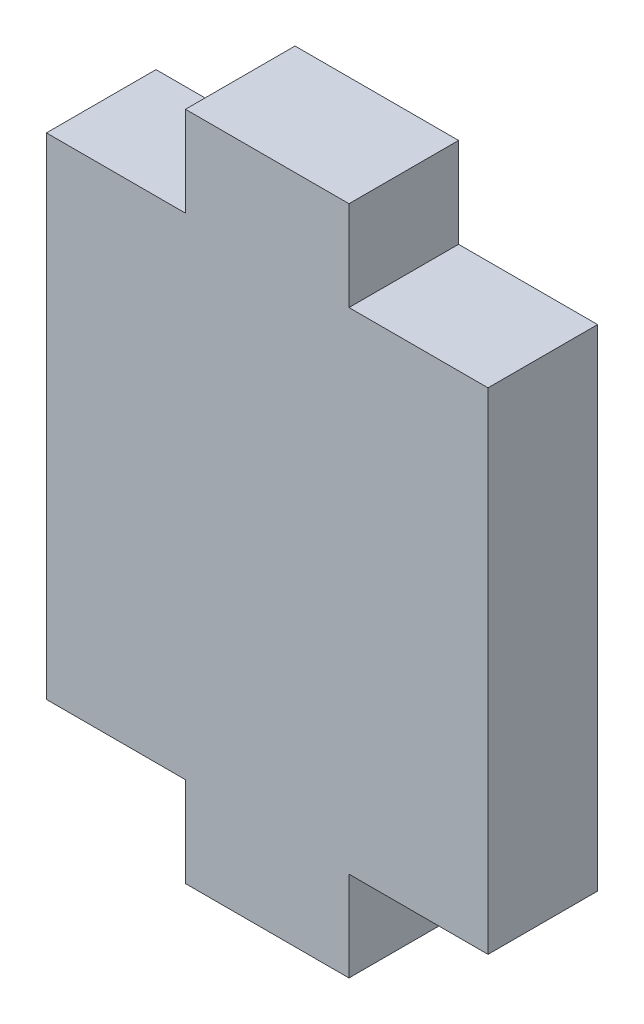
ISO-10303-21;
HEADER;
FILE_DESCRIPTION(('STEP AP214'),'2;1');
FILE_NAME('part.step','',(''),(''),'','','');
FILE_SCHEMA(('AUTOMOTIVE_DESIGN { 1 0 10303 214 1 1 1 1 }'));
ENDSEC;
DATA;
#1=APPLICATION_CONTEXT('core data for automotive mechanical design processes');
#2=APPLICATION_PROTOCOL_DEFINITION('international standard','automotive_design',2000,#1);
#3=PRODUCT_CONTEXT('',#1,'mechanical');
#4=PRODUCT('Part','Part','',(#3));
#5=PRODUCT_RELATED_PRODUCT_CATEGORY('part','',(#4));
#6=PRODUCT_DEFINITION_FORMATION('','',#4);
#7=PRODUCT_DEFINITION_CONTEXT('part definition',#1,'design');
#8=PRODUCT_DEFINITION('design','',#6,#7);
#9=PRODUCT_DEFINITION_SHAPE('','',#8);
#10=(LENGTH_UNIT() NAMED_UNIT(*) SI_UNIT(.MILLI.,.METRE.));
#11=(NAMED_UNIT(*) PLANE_ANGLE_UNIT() SI_UNIT($,.RADIAN.));
#12=(NAMED_UNIT(*) SI_UNIT($,.STERADIAN.) SOLID_ANGLE_UNIT());
#13=UNCERTAINTY_MEASURE_WITH_UNIT(LENGTH_MEASURE(1.E-05),#10,'distance_accuracy_value','');
#14=(GEOMETRIC_REPRESENTATION_CONTEXT(3) GLOBAL_UNCERTAINTY_ASSIGNED_CONTEXT((#13)) GLOBAL_UNIT_ASSIGNED_CONTEXT((#10,
#11,#12)) REPRESENTATION_CONTEXT('',''));
#15=CARTESIAN_POINT('',(0.,0.,0.));
#16=DIRECTION('',(0.,0.,1.));
#17=DIRECTION('',(1.,0.,0.));
#18=AXIS2_PLACEMENT_3D('',#15,#16,#17);
#19=CARTESIAN_POINT('',(5.,15.,-6.7));
#20=DIRECTION('',(0.,-1.,0.));
#21=DIRECTION('',(1.,0.,0.));
#22=AXIS2_PLACEMENT_3D('',#19,#20,#21);
#23=PLANE('',#22);
#24=DIRECTION('',(-1.,0.,0.));
#25=VECTOR('',#24,1.);
#26=CARTESIAN_POINT('',(5.,15.,0.));
#27=LINE('',#26,#25);
#28=CARTESIAN_POINT('',(13.5,15.,0.));
#29=VERTEX_POINT('',#28);
#30=CARTESIAN_POINT('',(5.,15.,0.));
#31=VERTEX_POINT('',#30);
#32=EDGE_CURVE('E155',#29,#31,#27,.T.);
#33=ORIENTED_EDGE('',*,*,#32,.F.);
#34=DIRECTION('',(0.,0.,1.));
#35=VECTOR('',#34,1.);
#36=CARTESIAN_POINT('',(13.5,15.,-6.7));
#37=LINE('',#36,#35);
#38=CARTESIAN_POINT('',(13.5,15.,-6.7));
#39=VERTEX_POINT('',#38);
#40=EDGE_CURVE('E154',#39,#29,#37,.T.);
#41=ORIENTED_EDGE('',*,*,#40,.F.);
#42=DIRECTION('',(-1.,0.,0.));
#43=VECTOR('',#42,1.);
#44=CARTESIAN_POINT('',(5.,15.,-6.7));
#45=LINE('',#44,#43);
#46=CARTESIAN_POINT('',(5.,15.,-6.7));
#47=VERTEX_POINT('',#46);
#48=EDGE_CURVE('E185',#39,#47,#45,.T.);
#49=ORIENTED_EDGE('',*,*,#48,.T.);
#50=DIRECTION('',(0.,0.,1.));
#51=VECTOR('',#50,1.);
#52=CARTESIAN_POINT('',(5.,15.,-6.7));
#53=LINE('',#52,#51);
#54=EDGE_CURVE('E11',#47,#31,#53,.T.);
#55=ORIENTED_EDGE('',*,*,#54,.T.);
#56=EDGE_LOOP('',(#33,#41,#49,#55));
#57=FACE_BOUND('',#56,.T.);
#58=ADVANCED_FACE('F35',(#57),#23,.F.);
#59=CARTESIAN_POINT('',(5.,15.,-6.7));
#60=DIRECTION('',(-1.,0.,0.));
#61=DIRECTION('',(0.,0.,-1.));
#62=AXIS2_PLACEMENT_3D('',#59,#60,#61);
#63=PLANE('',#62);
#64=DIRECTION('',(0.,1.,0.));
#65=VECTOR('',#64,1.);
#66=CARTESIAN_POINT('',(5.,15.,0.));
#67=LINE('',#66,#65);
#68=CARTESIAN_POINT('',(5.,20.5,0.));
#69=VERTEX_POINT('',#68);
#70=EDGE_CURVE('E157',#31,#69,#67,.T.);
#71=ORIENTED_EDGE('',*,*,#70,.F.);
#72=ORIENTED_EDGE('',*,*,#54,.F.);
#73=DIRECTION('',(0.,1.,0.));
#74=VECTOR('',#73,1.);
#75=CARTESIAN_POINT('',(5.,15.,-6.7));
#76=LINE('',#75,#74);
#77=CARTESIAN_POINT('',(5.,20.5,-6.7));
#78=VERTEX_POINT('',#77);
#79=EDGE_CURVE('E101',#47,#78,#76,.T.);
#80=ORIENTED_EDGE('',*,*,#79,.T.);
#81=DIRECTION('',(0.,0.,1.));
#82=VECTOR('',#81,1.);
#83=CARTESIAN_POINT('',(5.,20.5,-6.7));
#84=LINE('',#83,#82);
#85=EDGE_CURVE('E43',#78,#69,#84,.T.);
#86=ORIENTED_EDGE('',*,*,#85,.T.);
#87=EDGE_LOOP('',(#71,#72,#80,#86));
#88=FACE_BOUND('',#87,.T.);
#89=ADVANCED_FACE('F209',(#88),#63,.F.);
#90=CARTESIAN_POINT('',(5.,20.5,-6.7));
#91=DIRECTION('',(0.,-1.,0.));
#92=DIRECTION('',(0.,0.,1.));
#93=AXIS2_PLACEMENT_3D('',#90,#91,#92);
#94=PLANE('',#93);
#95=DIRECTION('',(-1.,0.,0.));
#96=VECTOR('',#95,1.);
#97=CARTESIAN_POINT('',(5.,20.5,0.));
#98=LINE('',#97,#96);
#99=CARTESIAN_POINT('',(-5.,20.5,0.));
#100=VERTEX_POINT('',#99);
#101=EDGE_CURVE('E160',#69,#100,#98,.T.);
#102=ORIENTED_EDGE('',*,*,#101,.F.);
#103=ORIENTED_EDGE('',*,*,#85,.F.);
#104=DIRECTION('',(-1.,0.,0.));
#105=VECTOR('',#104,1.);
#106=CARTESIAN_POINT('',(5.,20.5,-6.7));
#107=LINE('',#106,#105);
#108=CARTESIAN_POINT('',(-5.,20.5,-6.7));
#109=VERTEX_POINT('',#108);
#110=EDGE_CURVE('E218',#78,#109,#107,.T.);
#111=ORIENTED_EDGE('',*,*,#110,.T.);
#112=DIRECTION('',(0.,0.,1.));
#113=VECTOR('',#112,1.);
#114=CARTESIAN_POINT('',(-5.,20.5,-6.7));
#115=LINE('',#114,#113);
#116=EDGE_CURVE('E204',#109,#100,#115,.T.);
#117=ORIENTED_EDGE('',*,*,#116,.T.);
#118=EDGE_LOOP('',(#102,#103,#111,#117));
#119=FACE_BOUND('',#118,.T.);
#120=ADVANCED_FACE('F252',(#119),#94,.F.);
#121=CARTESIAN_POINT('',(-5.,15.,-6.7));
#122=DIRECTION('',(1.,0.,0.));
#123=DIRECTION('',(0.,0.,1.));
#124=AXIS2_PLACEMENT_3D('',#121,#122,#123);
#125=PLANE('',#124);
#126=DIRECTION('',(0.,-1.,0.));
#127=VECTOR('',#126,1.);
#128=CARTESIAN_POINT('',(-5.,15.,0.));
#129=LINE('',#128,#127);
#130=CARTESIAN_POINT('',(-5.,15.,0.));
#131=VERTEX_POINT('',#130);
#132=EDGE_CURVE('E163',#100,#131,#129,.T.);
#133=ORIENTED_EDGE('',*,*,#132,.F.);
#134=ORIENTED_EDGE('',*,*,#116,.F.);
#135=DIRECTION('',(0.,-1.,0.));
#136=VECTOR('',#135,1.);
#137=CARTESIAN_POINT('',(-5.,15.,-6.7));
#138=LINE('',#137,#136);
#139=CARTESIAN_POINT('',(-5.,15.,-6.7));
#140=VERTEX_POINT('',#139);
#141=EDGE_CURVE('E222',#109,#140,#138,.T.);
#142=ORIENTED_EDGE('',*,*,#141,.T.);
#143=DIRECTION('',(0.,0.,1.));
#144=VECTOR('',#143,1.);
#145=CARTESIAN_POINT('',(-5.,15.,-6.7));
#146=LINE('',#145,#144);
#147=EDGE_CURVE('E201',#140,#131,#146,.T.);
#148=ORIENTED_EDGE('',*,*,#147,.T.);
#149=EDGE_LOOP('',(#133,#134,#142,#148));
#150=FACE_BOUND('',#149,.T.);
#151=ADVANCED_FACE('F251',(#150),#125,.F.);
#152=CARTESIAN_POINT('',(-13.5,15.,-6.7));
#153=DIRECTION('',(0.,-1.,0.));
#154=DIRECTION('',(0.,0.,1.));
#155=AXIS2_PLACEMENT_3D('',#152,#153,#154);
#156=PLANE('',#155);
#157=DIRECTION('',(-1.,0.,0.));
#158=VECTOR('',#157,1.);
#159=CARTESIAN_POINT('',(-13.5,15.,0.));
#160=LINE('',#159,#158);
#161=CARTESIAN_POINT('',(-13.5,15.,0.));
#162=VERTEX_POINT('',#161);
#163=EDGE_CURVE('E166',#131,#162,#160,.T.);
#164=ORIENTED_EDGE('',*,*,#163,.F.);
#165=ORIENTED_EDGE('',*,*,#147,.F.);
#166=DIRECTION('',(-1.,0.,0.));
#167=VECTOR('',#166,1.);
#168=CARTESIAN_POINT('',(-13.5,15.,-6.7));
#169=LINE('',#168,#167);
#170=CARTESIAN_POINT('',(-13.5,15.,-6.7));
#171=VERTEX_POINT('',#170);
#172=EDGE_CURVE('E225',#140,#171,#169,.T.);
#173=ORIENTED_EDGE('',*,*,#172,.T.);
#174=DIRECTION('',(0.,0.,1.));
#175=VECTOR('',#174,1.);
#176=CARTESIAN_POINT('',(-13.5,15.,-6.7));
#177=LINE('',#176,#175);
#178=EDGE_CURVE('E198',#171,#162,#177,.T.);
#179=ORIENTED_EDGE('',*,*,#178,.T.);
#180=EDGE_LOOP('',(#164,#165,#173,#179));
#181=FACE_BOUND('',#180,.T.);
#182=ADVANCED_FACE('F249',(#181),#156,.F.);
#183=CARTESIAN_POINT('',(-13.5,-15.,-6.7));
#184=DIRECTION('',(1.,0.,0.));
#185=DIRECTION('',(0.,0.,1.));
#186=AXIS2_PLACEMENT_3D('',#183,#184,#185);
#187=PLANE('',#186);
#188=DIRECTION('',(0.,-1.,0.));
#189=VECTOR('',#188,1.);
#190=CARTESIAN_POINT('',(-13.5,-15.,0.));
#191=LINE('',#190,#189);
#192=CARTESIAN_POINT('',(-13.5,-15.,0.));
#193=VERTEX_POINT('',#192);
#194=EDGE_CURVE('E169',#162,#193,#191,.T.);
#195=ORIENTED_EDGE('',*,*,#194,.F.);
#196=ORIENTED_EDGE('',*,*,#178,.F.);
#197=DIRECTION('',(0.,-1.,0.));
#198=VECTOR('',#197,1.);
#199=CARTESIAN_POINT('',(-13.5,-15.,-6.7));
#200=LINE('',#199,#198);
#201=CARTESIAN_POINT('',(-13.5,-15.,-6.7));
#202=VERTEX_POINT('',#201);
#203=EDGE_CURVE('E228',#171,#202,#200,.T.);
#204=ORIENTED_EDGE('',*,*,#203,.T.);
#205=DIRECTION('',(0.,0.,1.));
#206=VECTOR('',#205,1.);
#207=CARTESIAN_POINT('',(-13.5,-15.,-6.7));
#208=LINE('',#207,#206);
#209=EDGE_CURVE('E195',#202,#193,#208,.T.);
#210=ORIENTED_EDGE('',*,*,#209,.T.);
#211=EDGE_LOOP('',(#195,#196,#204,#210));
#212=FACE_BOUND('',#211,.T.);
#213=ADVANCED_FACE('F245',(#212),#187,.F.);
#214=CARTESIAN_POINT('',(-13.5,-15.,-6.7));
#215=DIRECTION('',(0.,1.,0.));
#216=DIRECTION('',(-1.,0.,0.));
#217=AXIS2_PLACEMENT_3D('',#214,#215,#216);
#218=PLANE('',#217);
#219=DIRECTION('',(1.,0.,0.));
#220=VECTOR('',#219,1.);
#221=CARTESIAN_POINT('',(-13.5,-15.,0.));
#222=LINE('',#221,#220);
#223=CARTESIAN_POINT('',(-5.,-15.,0.));
#224=VERTEX_POINT('',#223);
#225=EDGE_CURVE('E172',#193,#224,#222,.T.);
#226=ORIENTED_EDGE('',*,*,#225,.F.);
#227=ORIENTED_EDGE('',*,*,#209,.F.);
#228=DIRECTION('',(1.,0.,0.));
#229=VECTOR('',#228,1.);
#230=CARTESIAN_POINT('',(-13.5,-15.,-6.7));
#231=LINE('',#230,#229);
#232=CARTESIAN_POINT('',(-5.,-15.,-6.7));
#233=VERTEX_POINT('',#232);
#234=EDGE_CURVE('E231',#202,#233,#231,.T.);
#235=ORIENTED_EDGE('',*,*,#234,.T.);
#236=DIRECTION('',(0.,0.,1.));
#237=VECTOR('',#236,1.);
#238=CARTESIAN_POINT('',(-5.,-15.,-6.7));
#239=LINE('',#238,#237);
#240=EDGE_CURVE('E192',#233,#224,#239,.T.);
#241=ORIENTED_EDGE('',*,*,#240,.T.);
#242=EDGE_LOOP('',(#226,#227,#235,#241));
#243=FACE_BOUND('',#242,.T.);
#244=ADVANCED_FACE('F242',(#243),#218,.F.);
#245=CARTESIAN_POINT('',(-5.,-15.,-6.7));
#246=DIRECTION('',(1.,0.,0.));
#247=DIRECTION('',(0.,1.,0.));
#248=AXIS2_PLACEMENT_3D('',#245,#246,#247);
#249=PLANE('',#248);
#250=DIRECTION('',(0.,-1.,0.));
#251=VECTOR('',#250,1.);
#252=CARTESIAN_POINT('',(-5.,-15.,0.));
#253=LINE('',#252,#251);
#254=CARTESIAN_POINT('',(-5.,-20.5,0.));
#255=VERTEX_POINT('',#254);
#256=EDGE_CURVE('E175',#224,#255,#253,.T.);
#257=ORIENTED_EDGE('',*,*,#256,.F.);
#258=ORIENTED_EDGE('',*,*,#240,.F.);
#259=DIRECTION('',(0.,-1.,0.));
#260=VECTOR('',#259,1.);
#261=CARTESIAN_POINT('',(-5.,-15.,-6.7));
#262=LINE('',#261,#260);
#263=CARTESIAN_POINT('',(-5.,-20.5,-6.7));
#264=VERTEX_POINT('',#263);
#265=EDGE_CURVE('E149',#233,#264,#262,.T.);
#266=ORIENTED_EDGE('',*,*,#265,.T.);
#267=DIRECTION('',(0.,0.,1.));
#268=VECTOR('',#267,1.);
#269=CARTESIAN_POINT('',(-5.,-20.5,-6.7));
#270=LINE('',#269,#268);
#271=EDGE_CURVE('E189',#264,#255,#270,.T.);
#272=ORIENTED_EDGE('',*,*,#271,.T.);
#273=EDGE_LOOP('',(#257,#258,#266,#272));
#274=FACE_BOUND('',#273,.T.);
#275=ADVANCED_FACE('F236',(#274),#249,.F.);
#276=CARTESIAN_POINT('',(5.,-20.5,-6.7));
#277=DIRECTION('',(0.,1.,0.));
#278=DIRECTION('',(0.,0.,-1.));
#279=AXIS2_PLACEMENT_3D('',#276,#277,#278);
#280=PLANE('',#279);
#281=DIRECTION('',(1.,0.,0.));
#282=VECTOR('',#281,1.);
#283=CARTESIAN_POINT('',(5.,-20.5,0.));
#284=LINE('',#283,#282);
#285=CARTESIAN_POINT('',(5.,-20.5,0.));
#286=VERTEX_POINT('',#285);
#287=EDGE_CURVE('E178',#255,#286,#284,.T.);
#288=ORIENTED_EDGE('',*,*,#287,.F.);
#289=ORIENTED_EDGE('',*,*,#271,.F.);
#290=DIRECTION('',(1.,0.,0.));
#291=VECTOR('',#290,1.);
#292=CARTESIAN_POINT('',(5.,-20.5,-6.7));
#293=LINE('',#292,#291);
#294=CARTESIAN_POINT('',(5.,-20.5,-6.7));
#295=VERTEX_POINT('',#294);
#296=EDGE_CURVE('E147',#264,#295,#293,.T.);
#297=ORIENTED_EDGE('',*,*,#296,.T.);
#298=DIRECTION('',(0.,0.,1.));
#299=VECTOR('',#298,1.);
#300=CARTESIAN_POINT('',(5.,-20.5,-6.7));
#301=LINE('',#300,#299);
#302=EDGE_CURVE('E141',#295,#286,#301,.T.);
#303=ORIENTED_EDGE('',*,*,#302,.T.);
#304=EDGE_LOOP('',(#288,#289,#297,#303));
#305=FACE_BOUND('',#304,.T.);
#306=ADVANCED_FACE('F240',(#305),#280,.F.);
#307=CARTESIAN_POINT('',(5.,-15.,-6.7));
#308=DIRECTION('',(-1.,0.,0.));
#309=DIRECTION('',(0.,-1.,0.));
#310=AXIS2_PLACEMENT_3D('',#307,#308,#309);
#311=PLANE('',#310);
#312=DIRECTION('',(0.,1.,0.));
#313=VECTOR('',#312,1.);
#314=CARTESIAN_POINT('',(5.,-15.,0.));
#315=LINE('',#314,#313);
#316=CARTESIAN_POINT('',(5.,-15.,0.));
#317=VERTEX_POINT('',#316);
#318=EDGE_CURVE('E181',#286,#317,#315,.T.);
#319=ORIENTED_EDGE('',*,*,#318,.F.);
#320=ORIENTED_EDGE('',*,*,#302,.F.);
#321=DIRECTION('',(0.,1.,0.));
#322=VECTOR('',#321,1.);
#323=CARTESIAN_POINT('',(5.,-15.,-6.7));
#324=LINE('',#323,#322);
#325=CARTESIAN_POINT('',(5.,-15.,-6.7));
#326=VERTEX_POINT('',#325);
#327=EDGE_CURVE('E131',#295,#326,#324,.T.);
#328=ORIENTED_EDGE('',*,*,#327,.T.);
#329=DIRECTION('',(0.,0.,1.));
#330=VECTOR('',#329,1.);
#331=CARTESIAN_POINT('',(5.,-15.,-6.7));
#332=LINE('',#331,#330);
#333=EDGE_CURVE('E136',#326,#317,#332,.T.);
#334=ORIENTED_EDGE('',*,*,#333,.T.);
#335=EDGE_LOOP('',(#319,#320,#328,#334));
#336=FACE_BOUND('',#335,.T.);
#337=ADVANCED_FACE('F144',(#336),#311,.F.);
#338=CARTESIAN_POINT('',(5.,-15.,-6.7));
#339=DIRECTION('',(0.,1.,0.));
#340=DIRECTION('',(-1.,0.,0.));
#341=AXIS2_PLACEMENT_3D('',#338,#339,#340);
#342=PLANE('',#341);
#343=DIRECTION('',(1.,0.,0.));
#344=VECTOR('',#343,1.);
#345=CARTESIAN_POINT('',(5.,-15.,0.));
#346=LINE('',#345,#344);
#347=CARTESIAN_POINT('',(13.5,-15.,0.));
#348=VERTEX_POINT('',#347);
#349=EDGE_CURVE('E138',#317,#348,#346,.T.);
#350=ORIENTED_EDGE('',*,*,#349,.F.);
#351=ORIENTED_EDGE('',*,*,#333,.F.);
#352=DIRECTION('',(1.,0.,0.));
#353=VECTOR('',#352,1.);
#354=CARTESIAN_POINT('',(5.,-15.,-6.7));
#355=LINE('',#354,#353);
#356=CARTESIAN_POINT('',(13.5,-15.,-6.7));
#357=VERTEX_POINT('',#356);
#358=EDGE_CURVE('E127',#326,#357,#355,.T.);
#359=ORIENTED_EDGE('',*,*,#358,.T.);
#360=DIRECTION('',(0.,0.,1.));
#361=VECTOR('',#360,1.);
#362=CARTESIAN_POINT('',(13.5,-15.,-6.7));
#363=LINE('',#362,#361);
#364=EDGE_CURVE('E142',#357,#348,#363,.T.);
#365=ORIENTED_EDGE('',*,*,#364,.T.);
#366=EDGE_LOOP('',(#350,#351,#359,#365));
#367=FACE_BOUND('',#366,.T.);
#368=ADVANCED_FACE('F137',(#367),#342,.F.);
#369=CARTESIAN_POINT('',(13.5,-15.,-6.7));
#370=DIRECTION('',(-1.,0.,0.));
#371=DIRECTION('',(0.,0.,-1.));
#372=AXIS2_PLACEMENT_3D('',#369,#370,#371);
#373=PLANE('',#372);
#374=DIRECTION('',(0.,1.,0.));
#375=VECTOR('',#374,1.);
#376=CARTESIAN_POINT('',(13.5,-15.,0.));
#377=LINE('',#376,#375);
#378=EDGE_CURVE('E89',#348,#29,#377,.T.);
#379=ORIENTED_EDGE('',*,*,#378,.F.);
#380=ORIENTED_EDGE('',*,*,#364,.F.);
#381=DIRECTION('',(0.,1.,0.));
#382=VECTOR('',#381,1.);
#383=CARTESIAN_POINT('',(13.5,-15.,-6.7));
#384=LINE('',#383,#382);
#385=EDGE_CURVE('E51',#357,#39,#384,.T.);
#386=ORIENTED_EDGE('',*,*,#385,.T.);
#387=ORIENTED_EDGE('',*,*,#40,.T.);
#388=EDGE_LOOP('',(#379,#380,#386,#387));
#389=FACE_BOUND('',#388,.T.);
#390=ADVANCED_FACE('F334',(#389),#373,.F.);
#391=CARTESIAN_POINT('',(0.,0.,-6.7));
#392=DIRECTION('',(0.,0.,-1.));
#393=DIRECTION('',(1.,0.,0.));
#394=AXIS2_PLACEMENT_3D('',#391,#392,#393);
#395=PLANE('',#394);
#396=ORIENTED_EDGE('',*,*,#48,.F.);
#397=ORIENTED_EDGE('',*,*,#385,.F.);
#398=ORIENTED_EDGE('',*,*,#358,.F.);
#399=ORIENTED_EDGE('',*,*,#327,.F.);
#400=ORIENTED_EDGE('',*,*,#296,.F.);
#401=ORIENTED_EDGE('',*,*,#265,.F.);
#402=ORIENTED_EDGE('',*,*,#234,.F.);
#403=ORIENTED_EDGE('',*,*,#203,.F.);
#404=ORIENTED_EDGE('',*,*,#172,.F.);
#405=ORIENTED_EDGE('',*,*,#141,.F.);
#406=ORIENTED_EDGE('',*,*,#110,.F.);
#407=ORIENTED_EDGE('',*,*,#79,.F.);
#408=EDGE_LOOP('',(#396,#397,#398,#399,#400,#401,#402,#403,#404,#405,#406,#407));
#409=FACE_BOUND('',#408,.T.);
#410=ADVANCED_FACE('F129',(#409),#395,.T.);
#411=CARTESIAN_POINT('',(0.,0.,0.));
#412=DIRECTION('',(0.,0.,-1.));
#413=DIRECTION('',(1.,0.,0.));
#414=AXIS2_PLACEMENT_3D('',#411,#412,#413);
#415=PLANE('',#414);
#416=ORIENTED_EDGE('',*,*,#32,.T.);
#417=ORIENTED_EDGE('',*,*,#70,.T.);
#418=ORIENTED_EDGE('',*,*,#101,.T.);
#419=ORIENTED_EDGE('',*,*,#132,.T.);
#420=ORIENTED_EDGE('',*,*,#163,.T.);
#421=ORIENTED_EDGE('',*,*,#194,.T.);
#422=ORIENTED_EDGE('',*,*,#225,.T.);
#423=ORIENTED_EDGE('',*,*,#256,.T.);
#424=ORIENTED_EDGE('',*,*,#287,.T.);
#425=ORIENTED_EDGE('',*,*,#318,.T.);
#426=ORIENTED_EDGE('',*,*,#349,.T.);
#427=ORIENTED_EDGE('',*,*,#378,.T.);
#428=EDGE_LOOP('',(#416,#417,#418,#419,#420,#421,#422,#423,#424,#425,#426,#427));
#429=FACE_BOUND('',#428,.T.);
#430=ADVANCED_FACE('F212',(#429),#415,.F.);
#431=CLOSED_SHELL('',(#58,#89,#120,#151,#182,#213,#244,#275,#306,#337,#368,#390,#410,#430));
#432=MANIFOLD_SOLID_BREP('B2',#431);
#433=ADVANCED_BREP_SHAPE_REPRESENTATION('',(#18,#432),#14);
#434=SHAPE_DEFINITION_REPRESENTATION(#9,#433);
ENDSEC;
END-ISO-10303-21;
